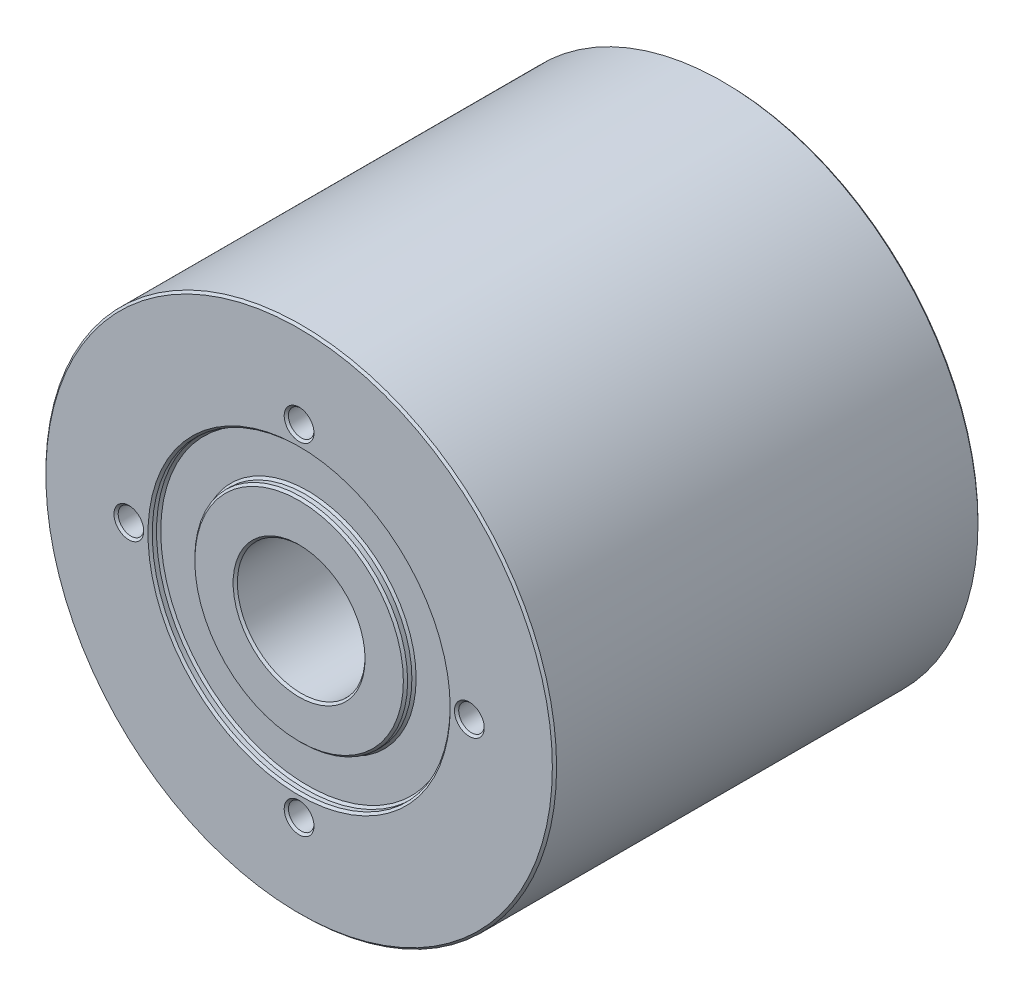
ISO-10303-21;
HEADER;
FILE_DESCRIPTION(('STEP AP214'),'2;1');
FILE_NAME('part.step','',(''),(''),'','','');
FILE_SCHEMA(('AUTOMOTIVE_DESIGN { 1 0 10303 214 1 1 1 1 }'));
ENDSEC;
DATA;
#1=APPLICATION_CONTEXT('core data for automotive mechanical design processes');
#2=APPLICATION_PROTOCOL_DEFINITION('international standard','automotive_design',2000,#1);
#3=PRODUCT_CONTEXT('',#1,'mechanical');
#4=PRODUCT('Part','Part','',(#3));
#5=PRODUCT_RELATED_PRODUCT_CATEGORY('part','',(#4));
#6=PRODUCT_DEFINITION_FORMATION('','',#4);
#7=PRODUCT_DEFINITION_CONTEXT('part definition',#1,'design');
#8=PRODUCT_DEFINITION('design','',#6,#7);
#9=PRODUCT_DEFINITION_SHAPE('','',#8);
#10=(LENGTH_UNIT() NAMED_UNIT(*) SI_UNIT(.MILLI.,.METRE.));
#11=(NAMED_UNIT(*) PLANE_ANGLE_UNIT() SI_UNIT($,.RADIAN.));
#12=(NAMED_UNIT(*) SI_UNIT($,.STERADIAN.) SOLID_ANGLE_UNIT());
#13=UNCERTAINTY_MEASURE_WITH_UNIT(LENGTH_MEASURE(1.E-05),#10,'distance_accuracy_value','');
#14=(GEOMETRIC_REPRESENTATION_CONTEXT(3) GLOBAL_UNCERTAINTY_ASSIGNED_CONTEXT((#13)) GLOBAL_UNIT_ASSIGNED_CONTEXT((#10,
#11,#12)) REPRESENTATION_CONTEXT('',''));
#15=CARTESIAN_POINT('',(0.,0.,0.));
#16=DIRECTION('',(0.,0.,1.));
#17=DIRECTION('',(1.,0.,0.));
#18=AXIS2_PLACEMENT_3D('',#15,#16,#17);
#19=CARTESIAN_POINT('',(1.664700123781E-13,0.,100.));
#20=DIRECTION('',(0.,0.,1.));
#21=DIRECTION('',(1.,0.,0.));
#22=AXIS2_PLACEMENT_3D('',#19,#20,#21);
#23=CYLINDRICAL_SURFACE('',#22,25.);
#24=DIRECTION('',(0.,0.,-1.));
#25=VECTOR('',#24,1.);
#26=CARTESIAN_POINT('',(25.,0.,100.));
#27=LINE('',#26,#25);
#28=CARTESIAN_POINT('',(25.,0.,99.5));
#29=VERTEX_POINT('',#28);
#30=CARTESIAN_POINT('',(25.,0.,98.5));
#31=VERTEX_POINT('',#30);
#32=EDGE_CURVE('E10',#29,#31,#27,.T.);
#33=ORIENTED_EDGE('',*,*,#32,.T.);
#34=CARTESIAN_POINT('',(1.664700123781E-13,0.,98.5));
#35=DIRECTION('',(0.,0.,1.));
#36=DIRECTION('',(1.,0.,0.));
#37=AXIS2_PLACEMENT_3D('',#34,#35,#36);
#38=CIRCLE('',#37,25.);
#39=EDGE_CURVE('E25',#31,#31,#38,.T.);
#40=ORIENTED_EDGE('',*,*,#39,.T.);
#41=ORIENTED_EDGE('',*,*,#32,.F.);
#42=CARTESIAN_POINT('',(1.664700123781E-13,0.,99.5));
#43=DIRECTION('',(0.,0.,1.));
#44=DIRECTION('',(1.,0.,0.));
#45=AXIS2_PLACEMENT_3D('',#42,#43,#44);
#46=CIRCLE('',#45,25.);
#47=EDGE_CURVE('E331',#29,#29,#46,.T.);
#48=ORIENTED_EDGE('',*,*,#47,.F.);
#49=EDGE_LOOP('',(#33,#40,#41,#48));
#50=FACE_BOUND('',#49,.T.);
#51=ADVANCED_FACE('F16',(#50),#23,.T.);
#52=CARTESIAN_POINT('',(1.664700123781E-13,0.,98.5));
#53=DIRECTION('',(0.,0.,-1.));
#54=DIRECTION('',(1.,0.,0.));
#55=AXIS2_PLACEMENT_3D('',#52,#53,#54);
#56=CONICAL_SURFACE('',#55,25.,0.785398163397);
#57=DIRECTION('',(-0.707106781186548,0.,0.707106781186548));
#58=VECTOR('',#57,1.);
#59=CARTESIAN_POINT('',(25.,0.,98.5));
#60=LINE('',#59,#58);
#61=CARTESIAN_POINT('',(25.5,0.,98.));
#62=VERTEX_POINT('',#61);
#63=EDGE_CURVE('E338',#62,#31,#60,.T.);
#64=ORIENTED_EDGE('',*,*,#63,.F.);
#65=CARTESIAN_POINT('',(1.664700123781E-13,0.,98.));
#66=DIRECTION('',(0.,0.,1.));
#67=DIRECTION('',(1.,0.,0.));
#68=AXIS2_PLACEMENT_3D('',#65,#66,#67);
#69=CIRCLE('',#68,25.5);
#70=EDGE_CURVE('E327',#62,#62,#69,.T.);
#71=ORIENTED_EDGE('',*,*,#70,.T.);
#72=ORIENTED_EDGE('',*,*,#63,.T.);
#73=ORIENTED_EDGE('',*,*,#39,.F.);
#74=EDGE_LOOP('',(#64,#71,#72,#73));
#75=FACE_BOUND('',#74,.T.);
#76=ADVANCED_FACE('F18',(#75),#56,.T.);
#77=CARTESIAN_POINT('',(1.664700123781E-13,0.,99.5));
#78=DIRECTION('',(0.,0.,-1.));
#79=DIRECTION('',(1.,0.,0.));
#80=AXIS2_PLACEMENT_3D('',#77,#78,#79);
#81=CONICAL_SURFACE('',#80,25.,0.785398163397);
#82=ORIENTED_EDGE('',*,*,#47,.T.);
#83=DIRECTION('',(0.707106781186548,0.,-0.707106781186548));
#84=VECTOR('',#83,1.);
#85=CARTESIAN_POINT('',(25.,0.,99.5));
#86=LINE('',#85,#84);
#87=CARTESIAN_POINT('',(24.5,0.,100.));
#88=VERTEX_POINT('',#87);
#89=EDGE_CURVE('E335',#88,#29,#86,.T.);
#90=ORIENTED_EDGE('',*,*,#89,.F.);
#91=CARTESIAN_POINT('',(1.664700123781E-13,0.,100.));
#92=DIRECTION('',(0.,0.,1.));
#93=DIRECTION('',(1.,0.,0.));
#94=AXIS2_PLACEMENT_3D('',#91,#92,#93);
#95=CIRCLE('',#94,24.5);
#96=EDGE_CURVE('E323',#88,#88,#95,.T.);
#97=ORIENTED_EDGE('',*,*,#96,.F.);
#98=ORIENTED_EDGE('',*,*,#89,.T.);
#99=EDGE_LOOP('',(#82,#90,#97,#98));
#100=FACE_BOUND('',#99,.T.);
#101=ADVANCED_FACE('F351',(#100),#81,.T.);
#102=CARTESIAN_POINT('',(0.,0.,98.));
#103=DIRECTION('',(0.,0.,1.));
#104=DIRECTION('',(1.,0.,0.));
#105=AXIS2_PLACEMENT_3D('',#102,#103,#104);
#106=PLANE('',#105);
#107=ORIENTED_EDGE('',*,*,#70,.F.);
#108=EDGE_LOOP('',(#107));
#109=FACE_BOUND('',#108,.T.);
#110=CARTESIAN_POINT('',(0.,0.,98.));
#111=DIRECTION('',(0.,0.,1.));
#112=DIRECTION('',(1.,0.,0.));
#113=AXIS2_PLACEMENT_3D('',#110,#111,#112);
#114=CIRCLE('',#113,34.5);
#115=CARTESIAN_POINT('',(34.5,0.,98.));
#116=VERTEX_POINT('',#115);
#117=EDGE_CURVE('E320',#116,#116,#114,.T.);
#118=ORIENTED_EDGE('',*,*,#117,.T.);
#119=EDGE_LOOP('',(#118));
#120=FACE_BOUND('',#119,.T.);
#121=ADVANCED_FACE('F347',(#109,#120),#106,.T.);
#122=CARTESIAN_POINT('',(0.,0.,100.));
#123=DIRECTION('',(0.,0.,1.));
#124=DIRECTION('',(1.,0.,0.));
#125=AXIS2_PLACEMENT_3D('',#122,#123,#124);
#126=PLANE('',#125);
#127=ORIENTED_EDGE('',*,*,#96,.T.);
#128=EDGE_LOOP('',(#127));
#129=FACE_BOUND('',#128,.T.);
#130=CARTESIAN_POINT('',(0.,0.,100.));
#131=DIRECTION('',(0.,0.,-1.));
#132=DIRECTION('',(1.,0.,0.));
#133=AXIS2_PLACEMENT_3D('',#130,#131,#132);
#134=CIRCLE('',#133,15.5);
#135=CARTESIAN_POINT('',(15.5,0.,100.));
#136=VERTEX_POINT('',#135);
#137=EDGE_CURVE('E285',#136,#136,#134,.T.);
#138=ORIENTED_EDGE('',*,*,#137,.T.);
#139=EDGE_LOOP('',(#138));
#140=FACE_BOUND('',#139,.T.);
#141=ADVANCED_FACE('F350',(#129,#140),#126,.T.);
#142=CARTESIAN_POINT('',(0.,0.,98.5));
#143=DIRECTION('',(0.,0.,1.));
#144=DIRECTION('',(1.,0.,0.));
#145=AXIS2_PLACEMENT_3D('',#142,#143,#144);
#146=CONICAL_SURFACE('',#145,35.,0.785398163397);
#147=DIRECTION('',(-0.707106781186548,0.,-0.707106781186548));
#148=VECTOR('',#147,1.);
#149=CARTESIAN_POINT('',(35.,0.,98.5));
#150=LINE('',#149,#148);
#151=CARTESIAN_POINT('',(35.,0.,98.5));
#152=VERTEX_POINT('',#151);
#153=EDGE_CURVE('E288',#152,#116,#150,.T.);
#154=ORIENTED_EDGE('',*,*,#153,.F.);
#155=CARTESIAN_POINT('',(0.,0.,98.5));
#156=DIRECTION('',(0.,0.,1.));
#157=DIRECTION('',(1.,0.,0.));
#158=AXIS2_PLACEMENT_3D('',#155,#156,#157);
#159=CIRCLE('',#158,35.);
#160=EDGE_CURVE('E310',#152,#152,#159,.T.);
#161=ORIENTED_EDGE('',*,*,#160,.T.);
#162=ORIENTED_EDGE('',*,*,#153,.T.);
#163=ORIENTED_EDGE('',*,*,#117,.F.);
#164=EDGE_LOOP('',(#154,#161,#162,#163));
#165=FACE_BOUND('',#164,.T.);
#166=ADVANCED_FACE('F355',(#165),#146,.F.);
#167=CARTESIAN_POINT('',(0.,0.,99.5));
#168=DIRECTION('',(0.,0.,1.));
#169=DIRECTION('',(1.,0.,0.));
#170=AXIS2_PLACEMENT_3D('',#167,#168,#169);
#171=CONICAL_SURFACE('',#170,15.,0.785398163397);
#172=DIRECTION('',(0.707106781186548,0.,0.707106781186548));
#173=VECTOR('',#172,1.);
#174=CARTESIAN_POINT('',(15.,0.,99.5));
#175=LINE('',#174,#173);
#176=CARTESIAN_POINT('',(15.,0.,99.5));
#177=VERTEX_POINT('',#176);
#178=EDGE_CURVE('E289',#177,#136,#175,.T.);
#179=ORIENTED_EDGE('',*,*,#178,.F.);
#180=CARTESIAN_POINT('',(0.,0.,99.5));
#181=DIRECTION('',(0.,0.,-1.));
#182=DIRECTION('',(1.,0.,0.));
#183=AXIS2_PLACEMENT_3D('',#180,#181,#182);
#184=CIRCLE('',#183,15.);
#185=EDGE_CURVE('E296',#177,#177,#184,.T.);
#186=ORIENTED_EDGE('',*,*,#185,.T.);
#187=ORIENTED_EDGE('',*,*,#178,.T.);
#188=ORIENTED_EDGE('',*,*,#137,.F.);
#189=EDGE_LOOP('',(#179,#186,#187,#188));
#190=FACE_BOUND('',#189,.T.);
#191=ADVANCED_FACE('F445',(#190),#171,.F.);
#192=CARTESIAN_POINT('',(0.,0.,100.));
#193=DIRECTION('',(0.,0.,1.));
#194=DIRECTION('',(1.,0.,0.));
#195=AXIS2_PLACEMENT_3D('',#192,#193,#194);
#196=CYLINDRICAL_SURFACE('',#195,35.);
#197=CARTESIAN_POINT('',(0.,0.,99.5));
#198=DIRECTION('',(0.,0.,1.));
#199=DIRECTION('',(1.,0.,0.));
#200=AXIS2_PLACEMENT_3D('',#197,#198,#199);
#201=CIRCLE('',#200,35.);
#202=CARTESIAN_POINT('',(35.,0.,99.5));
#203=VERTEX_POINT('',#202);
#204=EDGE_CURVE('E271',#203,#203,#201,.T.);
#205=ORIENTED_EDGE('',*,*,#204,.T.);
#206=DIRECTION('',(0.,0.,-1.));
#207=VECTOR('',#206,1.);
#208=CARTESIAN_POINT('',(35.,0.,100.));
#209=LINE('',#208,#207);
#210=EDGE_CURVE('E306',#203,#152,#209,.T.);
#211=ORIENTED_EDGE('',*,*,#210,.T.);
#212=ORIENTED_EDGE('',*,*,#160,.F.);
#213=ORIENTED_EDGE('',*,*,#210,.F.);
#214=EDGE_LOOP('',(#205,#211,#212,#213));
#215=FACE_BOUND('',#214,.T.);
#216=ADVANCED_FACE('F358',(#215),#196,.F.);
#217=CARTESIAN_POINT('',(0.,40.,0.));
#218=DIRECTION('',(0.,0.,-1.));
#219=DIRECTION('',(0.,1.,0.));
#220=AXIS2_PLACEMENT_3D('',#217,#218,#219);
#221=CYLINDRICAL_SURFACE('',#220,3.);
#222=DIRECTION('',(0.,0.,1.));
#223=VECTOR('',#222,1.);
#224=CARTESIAN_POINT('',(0.,43.,0.));
#225=LINE('',#224,#223);
#226=CARTESIAN_POINT('',(0.,43.,0.5));
#227=VERTEX_POINT('',#226);
#228=CARTESIAN_POINT('',(0.,43.,99.5));
#229=VERTEX_POINT('',#228);
#230=EDGE_CURVE('E303',#227,#229,#225,.T.);
#231=ORIENTED_EDGE('',*,*,#230,.F.);
#232=CARTESIAN_POINT('',(0.,40.,0.5));
#233=DIRECTION('',(0.,0.,1.));
#234=DIRECTION('',(0.,1.,0.));
#235=AXIS2_PLACEMENT_3D('',#232,#233,#234);
#236=CIRCLE('',#235,3.);
#237=EDGE_CURVE('E242',#227,#227,#236,.T.);
#238=ORIENTED_EDGE('',*,*,#237,.F.);
#239=ORIENTED_EDGE('',*,*,#230,.T.);
#240=CARTESIAN_POINT('',(0.,40.,99.5));
#241=DIRECTION('',(0.,0.,-1.));
#242=DIRECTION('',(0.,1.,0.));
#243=AXIS2_PLACEMENT_3D('',#240,#241,#242);
#244=CIRCLE('',#243,3.);
#245=EDGE_CURVE('E196',#229,#229,#244,.T.);
#246=ORIENTED_EDGE('',*,*,#245,.F.);
#247=EDGE_LOOP('',(#231,#238,#239,#246));
#248=FACE_BOUND('',#247,.T.);
#249=ADVANCED_FACE('F441',(#248),#221,.F.);
#250=CARTESIAN_POINT('',(-40.,0.,0.));
#251=DIRECTION('',(0.,0.,-1.));
#252=DIRECTION('',(-1.,0.,0.));
#253=AXIS2_PLACEMENT_3D('',#250,#251,#252);
#254=CYLINDRICAL_SURFACE('',#253,3.);
#255=DIRECTION('',(0.,0.,1.));
#256=VECTOR('',#255,1.);
#257=CARTESIAN_POINT('',(-43.,0.,0.));
#258=LINE('',#257,#256);
#259=CARTESIAN_POINT('',(-43.,0.,0.5));
#260=VERTEX_POINT('',#259);
#261=CARTESIAN_POINT('',(-43.,0.,99.5));
#262=VERTEX_POINT('',#261);
#263=EDGE_CURVE('E300',#260,#262,#258,.T.);
#264=ORIENTED_EDGE('',*,*,#263,.F.);
#265=CARTESIAN_POINT('',(-40.,0.,0.5));
#266=DIRECTION('',(0.,0.,1.));
#267=DIRECTION('',(-1.,0.,0.));
#268=AXIS2_PLACEMENT_3D('',#265,#266,#267);
#269=CIRCLE('',#268,3.);
#270=EDGE_CURVE('E171',#260,#260,#269,.T.);
#271=ORIENTED_EDGE('',*,*,#270,.F.);
#272=ORIENTED_EDGE('',*,*,#263,.T.);
#273=CARTESIAN_POINT('',(-40.,0.,99.5));
#274=DIRECTION('',(0.,0.,-1.));
#275=DIRECTION('',(-1.,0.,0.));
#276=AXIS2_PLACEMENT_3D('',#273,#274,#275);
#277=CIRCLE('',#276,3.);
#278=EDGE_CURVE('E259',#262,#262,#277,.T.);
#279=ORIENTED_EDGE('',*,*,#278,.F.);
#280=EDGE_LOOP('',(#264,#271,#272,#279));
#281=FACE_BOUND('',#280,.T.);
#282=ADVANCED_FACE('F439',(#281),#254,.F.);
#283=CARTESIAN_POINT('',(0.,0.,0.));
#284=DIRECTION('',(0.,0.,-1.));
#285=DIRECTION('',(1.,0.,0.));
#286=AXIS2_PLACEMENT_3D('',#283,#284,#285);
#287=CYLINDRICAL_SURFACE('',#286,15.);
#288=DIRECTION('',(0.,0.,1.));
#289=VECTOR('',#288,1.);
#290=CARTESIAN_POINT('',(15.,0.,0.));
#291=LINE('',#290,#289);
#292=CARTESIAN_POINT('',(15.,0.,0.5));
#293=VERTEX_POINT('',#292);
#294=EDGE_CURVE('E292',#293,#177,#291,.T.);
#295=ORIENTED_EDGE('',*,*,#294,.F.);
#296=CARTESIAN_POINT('',(0.,0.,0.5));
#297=DIRECTION('',(0.,0.,1.));
#298=DIRECTION('',(1.,0.,0.));
#299=AXIS2_PLACEMENT_3D('',#296,#297,#298);
#300=CIRCLE('',#299,15.);
#301=EDGE_CURVE('E169',#293,#293,#300,.T.);
#302=ORIENTED_EDGE('',*,*,#301,.F.);
#303=ORIENTED_EDGE('',*,*,#294,.T.);
#304=ORIENTED_EDGE('',*,*,#185,.F.);
#305=EDGE_LOOP('',(#295,#302,#303,#304));
#306=FACE_BOUND('',#305,.T.);
#307=ADVANCED_FACE('F462',(#306),#287,.F.);
#308=CARTESIAN_POINT('',(40.,0.,0.));
#309=DIRECTION('',(0.,0.,-1.));
#310=DIRECTION('',(1.,0.,0.));
#311=AXIS2_PLACEMENT_3D('',#308,#309,#310);
#312=CYLINDRICAL_SURFACE('',#311,3.);
#313=DIRECTION('',(0.,0.,1.));
#314=VECTOR('',#313,1.);
#315=CARTESIAN_POINT('',(43.,0.,0.));
#316=LINE('',#315,#314);
#317=CARTESIAN_POINT('',(43.,0.,0.5));
#318=VERTEX_POINT('',#317);
#319=CARTESIAN_POINT('',(43.,0.,99.5));
#320=VERTEX_POINT('',#319);
#321=EDGE_CURVE('E284',#318,#320,#316,.T.);
#322=ORIENTED_EDGE('',*,*,#321,.F.);
#323=CARTESIAN_POINT('',(40.,0.,0.5));
#324=DIRECTION('',(0.,0.,1.));
#325=DIRECTION('',(1.,0.,0.));
#326=AXIS2_PLACEMENT_3D('',#323,#324,#325);
#327=CIRCLE('',#326,3.);
#328=EDGE_CURVE('E225',#318,#318,#327,.T.);
#329=ORIENTED_EDGE('',*,*,#328,.F.);
#330=ORIENTED_EDGE('',*,*,#321,.T.);
#331=CARTESIAN_POINT('',(40.,0.,99.5));
#332=DIRECTION('',(0.,0.,-1.));
#333=DIRECTION('',(1.,0.,0.));
#334=AXIS2_PLACEMENT_3D('',#331,#332,#333);
#335=CIRCLE('',#334,3.);
#336=EDGE_CURVE('E275',#320,#320,#335,.T.);
#337=ORIENTED_EDGE('',*,*,#336,.F.);
#338=EDGE_LOOP('',(#322,#329,#330,#337));
#339=FACE_BOUND('',#338,.T.);
#340=ADVANCED_FACE('F464',(#339),#312,.F.);
#341=CARTESIAN_POINT('',(0.,-40.,0.));
#342=DIRECTION('',(0.,0.,-1.));
#343=DIRECTION('',(0.,-1.,0.));
#344=AXIS2_PLACEMENT_3D('',#341,#342,#343);
#345=CYLINDRICAL_SURFACE('',#344,3.);
#346=DIRECTION('',(0.,0.,1.));
#347=VECTOR('',#346,1.);
#348=CARTESIAN_POINT('',(0.,-43.,0.));
#349=LINE('',#348,#347);
#350=CARTESIAN_POINT('',(0.,-43.,0.5));
#351=VERTEX_POINT('',#350);
#352=CARTESIAN_POINT('',(0.,-43.,99.5));
#353=VERTEX_POINT('',#352);
#354=EDGE_CURVE('E195',#351,#353,#349,.T.);
#355=ORIENTED_EDGE('',*,*,#354,.F.);
#356=CARTESIAN_POINT('',(0.,-40.,0.5));
#357=DIRECTION('',(0.,0.,1.));
#358=DIRECTION('',(0.,-1.,0.));
#359=AXIS2_PLACEMENT_3D('',#356,#357,#358);
#360=CIRCLE('',#359,3.);
#361=EDGE_CURVE('E217',#351,#351,#360,.T.);
#362=ORIENTED_EDGE('',*,*,#361,.F.);
#363=ORIENTED_EDGE('',*,*,#354,.T.);
#364=CARTESIAN_POINT('',(0.,-40.,99.5));
#365=DIRECTION('',(0.,0.,-1.));
#366=DIRECTION('',(0.,-1.,0.));
#367=AXIS2_PLACEMENT_3D('',#364,#365,#366);
#368=CIRCLE('',#367,3.);
#369=EDGE_CURVE('E251',#353,#353,#368,.T.);
#370=ORIENTED_EDGE('',*,*,#369,.F.);
#371=EDGE_LOOP('',(#355,#362,#363,#370));
#372=FACE_BOUND('',#371,.T.);
#373=ADVANCED_FACE('F469',(#372),#345,.F.);
#374=CARTESIAN_POINT('',(0.,40.,99.5));
#375=DIRECTION('',(0.,0.,1.));
#376=DIRECTION('',(0.,1.,0.));
#377=AXIS2_PLACEMENT_3D('',#374,#375,#376);
#378=CONICAL_SURFACE('',#377,3.,0.785398163397);
#379=ORIENTED_EDGE('',*,*,#245,.T.);
#380=DIRECTION('',(0.,-0.707106781186548,-0.707106781186548));
#381=VECTOR('',#380,1.);
#382=CARTESIAN_POINT('',(0.,43.,99.5));
#383=LINE('',#382,#381);
#384=CARTESIAN_POINT('',(0.,43.5,100.));
#385=VERTEX_POINT('',#384);
#386=EDGE_CURVE('E191',#385,#229,#383,.T.);
#387=ORIENTED_EDGE('',*,*,#386,.F.);
#388=CARTESIAN_POINT('',(0.,40.,100.));
#389=DIRECTION('',(0.,0.,-1.));
#390=DIRECTION('',(0.,1.,0.));
#391=AXIS2_PLACEMENT_3D('',#388,#389,#390);
#392=CIRCLE('',#391,3.5);
#393=EDGE_CURVE('E213',#385,#385,#392,.T.);
#394=ORIENTED_EDGE('',*,*,#393,.F.);
#395=ORIENTED_EDGE('',*,*,#386,.T.);
#396=EDGE_LOOP('',(#379,#387,#394,#395));
#397=FACE_BOUND('',#396,.T.);
#398=ADVANCED_FACE('F476',(#397),#378,.F.);
#399=CARTESIAN_POINT('',(40.,0.,99.5));
#400=DIRECTION('',(0.,0.,1.));
#401=DIRECTION('',(1.,0.,0.));
#402=AXIS2_PLACEMENT_3D('',#399,#400,#401);
#403=CONICAL_SURFACE('',#402,3.,0.785398163397);
#404=ORIENTED_EDGE('',*,*,#336,.T.);
#405=DIRECTION('',(-0.707106781186548,0.,-0.707106781186548));
#406=VECTOR('',#405,1.);
#407=CARTESIAN_POINT('',(43.,0.,99.5));
#408=LINE('',#407,#406);
#409=CARTESIAN_POINT('',(43.5,0.,100.));
#410=VERTEX_POINT('',#409);
#411=EDGE_CURVE('E229',#410,#320,#408,.T.);
#412=ORIENTED_EDGE('',*,*,#411,.F.);
#413=CARTESIAN_POINT('',(40.,0.,100.));
#414=DIRECTION('',(0.,0.,-1.));
#415=DIRECTION('',(1.,0.,0.));
#416=AXIS2_PLACEMENT_3D('',#413,#414,#415);
#417=CIRCLE('',#416,3.5);
#418=EDGE_CURVE('E205',#410,#410,#417,.T.);
#419=ORIENTED_EDGE('',*,*,#418,.F.);
#420=ORIENTED_EDGE('',*,*,#411,.T.);
#421=EDGE_LOOP('',(#404,#412,#419,#420));
#422=FACE_BOUND('',#421,.T.);
#423=ADVANCED_FACE('F481',(#422),#403,.F.);
#424=CARTESIAN_POINT('',(0.,0.,99.5));
#425=DIRECTION('',(0.,0.,1.));
#426=DIRECTION('',(1.,0.,0.));
#427=AXIS2_PLACEMENT_3D('',#424,#425,#426);
#428=CONICAL_SURFACE('',#427,35.,0.785398163397);
#429=DIRECTION('',(-0.707106781186548,0.,-0.707106781186548));
#430=VECTOR('',#429,1.);
#431=CARTESIAN_POINT('',(35.,0.,99.5));
#432=LINE('',#431,#430);
#433=CARTESIAN_POINT('',(35.5,0.,100.));
#434=VERTEX_POINT('',#433);
#435=EDGE_CURVE('E267',#434,#203,#432,.T.);
#436=ORIENTED_EDGE('',*,*,#435,.F.);
#437=CARTESIAN_POINT('',(0.,0.,100.));
#438=DIRECTION('',(0.,0.,1.));
#439=DIRECTION('',(1.,0.,0.));
#440=AXIS2_PLACEMENT_3D('',#437,#438,#439);
#441=CIRCLE('',#440,35.5);
#442=EDGE_CURVE('E201',#434,#434,#441,.T.);
#443=ORIENTED_EDGE('',*,*,#442,.T.);
#444=ORIENTED_EDGE('',*,*,#435,.T.);
#445=ORIENTED_EDGE('',*,*,#204,.F.);
#446=EDGE_LOOP('',(#436,#443,#444,#445));
#447=FACE_BOUND('',#446,.T.);
#448=ADVANCED_FACE('F361',(#447),#428,.F.);
#449=CARTESIAN_POINT('',(-40.,0.,99.5));
#450=DIRECTION('',(0.,0.,1.));
#451=DIRECTION('',(-1.,0.,0.));
#452=AXIS2_PLACEMENT_3D('',#449,#450,#451);
#453=CONICAL_SURFACE('',#452,3.,0.785398163397);
#454=ORIENTED_EDGE('',*,*,#278,.T.);
#455=DIRECTION('',(0.707106781186548,0.,-0.707106781186548));
#456=VECTOR('',#455,1.);
#457=CARTESIAN_POINT('',(-43.,0.,99.5));
#458=LINE('',#457,#456);
#459=CARTESIAN_POINT('',(-43.5,0.,100.));
#460=VERTEX_POINT('',#459);
#461=EDGE_CURVE('E263',#460,#262,#458,.T.);
#462=ORIENTED_EDGE('',*,*,#461,.F.);
#463=CARTESIAN_POINT('',(-40.,0.,100.));
#464=DIRECTION('',(0.,0.,-1.));
#465=DIRECTION('',(-1.,0.,0.));
#466=AXIS2_PLACEMENT_3D('',#463,#464,#465);
#467=CIRCLE('',#466,3.5);
#468=EDGE_CURVE('E206',#460,#460,#467,.T.);
#469=ORIENTED_EDGE('',*,*,#468,.F.);
#470=ORIENTED_EDGE('',*,*,#461,.T.);
#471=EDGE_LOOP('',(#454,#462,#469,#470));
#472=FACE_BOUND('',#471,.T.);
#473=ADVANCED_FACE('F480',(#472),#453,.F.);
#474=CARTESIAN_POINT('',(0.,-40.,99.5));
#475=DIRECTION('',(0.,0.,1.));
#476=DIRECTION('',(0.,-1.,0.));
#477=AXIS2_PLACEMENT_3D('',#474,#475,#476);
#478=CONICAL_SURFACE('',#477,3.,0.785398163397);
#479=ORIENTED_EDGE('',*,*,#369,.T.);
#480=DIRECTION('',(0.,0.707106781186548,-0.707106781186548));
#481=VECTOR('',#480,1.);
#482=CARTESIAN_POINT('',(0.,-43.,99.5));
#483=LINE('',#482,#481);
#484=CARTESIAN_POINT('',(0.,-43.5,100.));
#485=VERTEX_POINT('',#484);
#486=EDGE_CURVE('E255',#485,#353,#483,.T.);
#487=ORIENTED_EDGE('',*,*,#486,.F.);
#488=CARTESIAN_POINT('',(0.,-40.,100.));
#489=DIRECTION('',(0.,0.,-1.));
#490=DIRECTION('',(0.,-1.,0.));
#491=AXIS2_PLACEMENT_3D('',#488,#489,#490);
#492=CIRCLE('',#491,3.5);
#493=EDGE_CURVE('E200',#485,#485,#492,.T.);
#494=ORIENTED_EDGE('',*,*,#493,.F.);
#495=ORIENTED_EDGE('',*,*,#486,.T.);
#496=EDGE_LOOP('',(#479,#487,#494,#495));
#497=FACE_BOUND('',#496,.T.);
#498=ADVANCED_FACE('F484',(#497),#478,.F.);
#499=CARTESIAN_POINT('',(0.,40.,0.5));
#500=DIRECTION('',(0.,0.,-1.));
#501=DIRECTION('',(0.,1.,0.));
#502=AXIS2_PLACEMENT_3D('',#499,#500,#501);
#503=CONICAL_SURFACE('',#502,3.,0.785398163397);
#504=ORIENTED_EDGE('',*,*,#237,.T.);
#505=DIRECTION('',(0.,-0.707106781186548,0.707106781186548));
#506=VECTOR('',#505,1.);
#507=CARTESIAN_POINT('',(0.,43.,0.5));
#508=LINE('',#507,#506);
#509=CARTESIAN_POINT('',(0.,43.5,0.));
#510=VERTEX_POINT('',#509);
#511=EDGE_CURVE('E247',#510,#227,#508,.T.);
#512=ORIENTED_EDGE('',*,*,#511,.F.);
#513=CARTESIAN_POINT('',(0.,40.,0.));
#514=DIRECTION('',(0.,0.,1.));
#515=DIRECTION('',(0.,1.,0.));
#516=AXIS2_PLACEMENT_3D('',#513,#514,#515);
#517=CIRCLE('',#516,3.5);
#518=EDGE_CURVE('E184',#510,#510,#517,.T.);
#519=ORIENTED_EDGE('',*,*,#518,.F.);
#520=ORIENTED_EDGE('',*,*,#511,.T.);
#521=EDGE_LOOP('',(#504,#512,#519,#520));
#522=FACE_BOUND('',#521,.T.);
#523=ADVANCED_FACE('F486',(#522),#503,.F.);
#524=CARTESIAN_POINT('',(-40.,0.,0.5));
#525=DIRECTION('',(0.,0.,-1.));
#526=DIRECTION('',(-1.,0.,0.));
#527=AXIS2_PLACEMENT_3D('',#524,#525,#526);
#528=CONICAL_SURFACE('',#527,3.,0.785398163397);
#529=ORIENTED_EDGE('',*,*,#270,.T.);
#530=DIRECTION('',(0.707106781186548,0.,0.707106781186548));
#531=VECTOR('',#530,1.);
#532=CARTESIAN_POINT('',(-43.,0.,0.5));
#533=LINE('',#532,#531);
#534=CARTESIAN_POINT('',(-43.5,0.,0.));
#535=VERTEX_POINT('',#534);
#536=EDGE_CURVE('E239',#535,#260,#533,.T.);
#537=ORIENTED_EDGE('',*,*,#536,.F.);
#538=CARTESIAN_POINT('',(-40.,0.,0.));
#539=DIRECTION('',(0.,0.,1.));
#540=DIRECTION('',(-1.,0.,0.));
#541=AXIS2_PLACEMENT_3D('',#538,#539,#540);
#542=CIRCLE('',#541,3.5);
#543=EDGE_CURVE('E177',#535,#535,#542,.T.);
#544=ORIENTED_EDGE('',*,*,#543,.F.);
#545=ORIENTED_EDGE('',*,*,#536,.T.);
#546=EDGE_LOOP('',(#529,#537,#544,#545));
#547=FACE_BOUND('',#546,.T.);
#548=ADVANCED_FACE('F489',(#547),#528,.F.);
#549=CARTESIAN_POINT('',(0.,0.,0.5));
#550=DIRECTION('',(0.,0.,-1.));
#551=DIRECTION('',(1.,0.,0.));
#552=AXIS2_PLACEMENT_3D('',#549,#550,#551);
#553=CONICAL_SURFACE('',#552,15.,0.785398163397);
#554=ORIENTED_EDGE('',*,*,#301,.T.);
#555=DIRECTION('',(-0.707106781186548,0.,0.707106781186548));
#556=VECTOR('',#555,1.);
#557=CARTESIAN_POINT('',(15.,0.,0.5));
#558=LINE('',#557,#556);
#559=CARTESIAN_POINT('',(15.5,0.,0.));
#560=VERTEX_POINT('',#559);
#561=EDGE_CURVE('E164',#560,#293,#558,.T.);
#562=ORIENTED_EDGE('',*,*,#561,.F.);
#563=CARTESIAN_POINT('',(0.,0.,0.));
#564=DIRECTION('',(0.,0.,1.));
#565=DIRECTION('',(1.,0.,0.));
#566=AXIS2_PLACEMENT_3D('',#563,#564,#565);
#567=CIRCLE('',#566,15.5);
#568=EDGE_CURVE('E167',#560,#560,#567,.T.);
#569=ORIENTED_EDGE('',*,*,#568,.F.);
#570=ORIENTED_EDGE('',*,*,#561,.T.);
#571=EDGE_LOOP('',(#554,#562,#569,#570));
#572=FACE_BOUND('',#571,.T.);
#573=ADVANCED_FACE('F166',(#572),#553,.F.);
#574=CARTESIAN_POINT('',(40.,0.,0.5));
#575=DIRECTION('',(0.,0.,-1.));
#576=DIRECTION('',(1.,0.,0.));
#577=AXIS2_PLACEMENT_3D('',#574,#575,#576);
#578=CONICAL_SURFACE('',#577,3.,0.785398163397);
#579=ORIENTED_EDGE('',*,*,#328,.T.);
#580=DIRECTION('',(-0.707106781186548,0.,0.707106781186548));
#581=VECTOR('',#580,1.);
#582=CARTESIAN_POINT('',(43.,0.,0.5));
#583=LINE('',#582,#581);
#584=CARTESIAN_POINT('',(43.5,0.,0.));
#585=VERTEX_POINT('',#584);
#586=EDGE_CURVE('E233',#585,#318,#583,.T.);
#587=ORIENTED_EDGE('',*,*,#586,.F.);
#588=CARTESIAN_POINT('',(40.,0.,0.));
#589=DIRECTION('',(0.,0.,1.));
#590=DIRECTION('',(1.,0.,0.));
#591=AXIS2_PLACEMENT_3D('',#588,#589,#590);
#592=CIRCLE('',#591,3.5);
#593=EDGE_CURVE('E178',#585,#585,#592,.T.);
#594=ORIENTED_EDGE('',*,*,#593,.F.);
#595=ORIENTED_EDGE('',*,*,#586,.T.);
#596=EDGE_LOOP('',(#579,#587,#594,#595));
#597=FACE_BOUND('',#596,.T.);
#598=ADVANCED_FACE('F496',(#597),#578,.F.);
#599=CARTESIAN_POINT('',(0.,-40.,0.5));
#600=DIRECTION('',(0.,0.,-1.));
#601=DIRECTION('',(0.,-1.,0.));
#602=AXIS2_PLACEMENT_3D('',#599,#600,#601);
#603=CONICAL_SURFACE('',#602,3.,0.785398163397);
#604=ORIENTED_EDGE('',*,*,#361,.T.);
#605=DIRECTION('',(0.,0.707106781186548,0.707106781186548));
#606=VECTOR('',#605,1.);
#607=CARTESIAN_POINT('',(0.,-43.,0.5));
#608=LINE('',#607,#606);
#609=CARTESIAN_POINT('',(0.,-43.5,0.));
#610=VERTEX_POINT('',#609);
#611=EDGE_CURVE('E221',#610,#351,#608,.T.);
#612=ORIENTED_EDGE('',*,*,#611,.F.);
#613=CARTESIAN_POINT('',(0.,-40.,0.));
#614=DIRECTION('',(0.,0.,1.));
#615=DIRECTION('',(0.,-1.,0.));
#616=AXIS2_PLACEMENT_3D('',#613,#614,#615);
#617=CIRCLE('',#616,3.5);
#618=EDGE_CURVE('E187',#610,#610,#617,.T.);
#619=ORIENTED_EDGE('',*,*,#618,.F.);
#620=ORIENTED_EDGE('',*,*,#611,.T.);
#621=EDGE_LOOP('',(#604,#612,#619,#620));
#622=FACE_BOUND('',#621,.T.);
#623=ADVANCED_FACE('F367',(#622),#603,.F.);
#624=CARTESIAN_POINT('',(0.,0.,100.));
#625=DIRECTION('',(0.,0.,1.));
#626=DIRECTION('',(1.,0.,0.));
#627=AXIS2_PLACEMENT_3D('',#624,#625,#626);
#628=PLANE('',#627);
#629=ORIENTED_EDGE('',*,*,#393,.T.);
#630=EDGE_LOOP('',(#629));
#631=FACE_BOUND('',#630,.T.);
#632=ORIENTED_EDGE('',*,*,#418,.T.);
#633=EDGE_LOOP('',(#632));
#634=FACE_BOUND('',#633,.T.);
#635=ORIENTED_EDGE('',*,*,#442,.F.);
#636=EDGE_LOOP('',(#635));
#637=FACE_BOUND('',#636,.T.);
#638=ORIENTED_EDGE('',*,*,#468,.T.);
#639=EDGE_LOOP('',(#638));
#640=FACE_BOUND('',#639,.T.);
#641=ORIENTED_EDGE('',*,*,#493,.T.);
#642=EDGE_LOOP('',(#641));
#643=FACE_BOUND('',#642,.T.);
#644=CARTESIAN_POINT('',(0.,0.,100.));
#645=DIRECTION('',(0.,0.,1.));
#646=DIRECTION('',(1.,0.,0.));
#647=AXIS2_PLACEMENT_3D('',#644,#645,#646);
#648=CIRCLE('',#647,59.5);
#649=CARTESIAN_POINT('',(59.5,0.,100.));
#650=VERTEX_POINT('',#649);
#651=EDGE_CURVE('E375',#650,#650,#648,.T.);
#652=ORIENTED_EDGE('',*,*,#651,.T.);
#653=EDGE_LOOP('',(#652));
#654=FACE_BOUND('',#653,.T.);
#655=ADVANCED_FACE('F364',(#631,#634,#637,#640,#643,#654),#628,.T.);
#656=CARTESIAN_POINT('',(0.,0.,0.));
#657=DIRECTION('',(0.,0.,1.));
#658=DIRECTION('',(1.,0.,0.));
#659=AXIS2_PLACEMENT_3D('',#656,#657,#658);
#660=PLANE('',#659);
#661=ORIENTED_EDGE('',*,*,#518,.T.);
#662=EDGE_LOOP('',(#661));
#663=FACE_BOUND('',#662,.T.);
#664=ORIENTED_EDGE('',*,*,#543,.T.);
#665=EDGE_LOOP('',(#664));
#666=FACE_BOUND('',#665,.T.);
#667=ORIENTED_EDGE('',*,*,#568,.T.);
#668=EDGE_LOOP('',(#667));
#669=FACE_BOUND('',#668,.T.);
#670=ORIENTED_EDGE('',*,*,#593,.T.);
#671=EDGE_LOOP('',(#670));
#672=FACE_BOUND('',#671,.T.);
#673=ORIENTED_EDGE('',*,*,#618,.T.);
#674=EDGE_LOOP('',(#673));
#675=FACE_BOUND('',#674,.T.);
#676=CARTESIAN_POINT('',(0.,0.,0.));
#677=DIRECTION('',(0.,0.,1.));
#678=DIRECTION('',(1.,0.,0.));
#679=AXIS2_PLACEMENT_3D('',#676,#677,#678);
#680=CIRCLE('',#679,59.5);
#681=CARTESIAN_POINT('',(59.5,0.,0.));
#682=VERTEX_POINT('',#681);
#683=EDGE_CURVE('E393',#682,#682,#680,.T.);
#684=ORIENTED_EDGE('',*,*,#683,.F.);
#685=EDGE_LOOP('',(#684));
#686=FACE_BOUND('',#685,.T.);
#687=ADVANCED_FACE('F174',(#663,#666,#669,#672,#675,#686),#660,.F.);
#688=CARTESIAN_POINT('',(0.,0.,99.5));
#689=DIRECTION('',(0.,0.,-1.));
#690=DIRECTION('',(1.,0.,0.));
#691=AXIS2_PLACEMENT_3D('',#688,#689,#690);
#692=CONICAL_SURFACE('',#691,60.,0.785398163397);
#693=DIRECTION('',(-0.707106781186548,0.,0.707106781186548));
#694=VECTOR('',#693,1.);
#695=CARTESIAN_POINT('',(60.,0.,99.5));
#696=LINE('',#695,#694);
#697=CARTESIAN_POINT('',(60.,0.,99.5));
#698=VERTEX_POINT('',#697);
#699=EDGE_CURVE('E379',#698,#650,#696,.T.);
#700=ORIENTED_EDGE('',*,*,#699,.F.);
#701=CARTESIAN_POINT('',(0.,0.,99.5));
#702=DIRECTION('',(0.,0.,1.));
#703=DIRECTION('',(1.,0.,0.));
#704=AXIS2_PLACEMENT_3D('',#701,#702,#703);
#705=CIRCLE('',#704,60.);
#706=EDGE_CURVE('E400',#698,#698,#705,.T.);
#707=ORIENTED_EDGE('',*,*,#706,.T.);
#708=ORIENTED_EDGE('',*,*,#699,.T.);
#709=ORIENTED_EDGE('',*,*,#651,.F.);
#710=EDGE_LOOP('',(#700,#707,#708,#709));
#711=FACE_BOUND('',#710,.T.);
#712=ADVANCED_FACE('F422',(#711),#692,.T.);
#713=CARTESIAN_POINT('',(0.,0.,0.5));
#714=DIRECTION('',(0.,0.,1.));
#715=DIRECTION('',(1.,0.,0.));
#716=AXIS2_PLACEMENT_3D('',#713,#714,#715);
#717=CONICAL_SURFACE('',#716,60.,0.785398163397);
#718=ORIENTED_EDGE('',*,*,#683,.T.);
#719=DIRECTION('',(-0.707106781186548,0.,-0.707106781186548));
#720=VECTOR('',#719,1.);
#721=CARTESIAN_POINT('',(60.,0.,0.5));
#722=LINE('',#721,#720);
#723=CARTESIAN_POINT('',(60.,0.,0.5));
#724=VERTEX_POINT('',#723);
#725=EDGE_CURVE('E385',#724,#682,#722,.T.);
#726=ORIENTED_EDGE('',*,*,#725,.F.);
#727=CARTESIAN_POINT('',(0.,0.,0.5));
#728=DIRECTION('',(0.,0.,1.));
#729=DIRECTION('',(1.,0.,0.));
#730=AXIS2_PLACEMENT_3D('',#727,#728,#729);
#731=CIRCLE('',#730,60.);
#732=EDGE_CURVE('E404',#724,#724,#731,.T.);
#733=ORIENTED_EDGE('',*,*,#732,.F.);
#734=ORIENTED_EDGE('',*,*,#725,.T.);
#735=EDGE_LOOP('',(#718,#726,#733,#734));
#736=FACE_BOUND('',#735,.T.);
#737=ADVANCED_FACE('F418',(#736),#717,.T.);
#738=CARTESIAN_POINT('',(0.,0.,0.));
#739=DIRECTION('',(0.,0.,1.));
#740=DIRECTION('',(1.,0.,0.));
#741=AXIS2_PLACEMENT_3D('',#738,#739,#740);
#742=CYLINDRICAL_SURFACE('',#741,60.);
#743=DIRECTION('',(0.,0.,1.));
#744=VECTOR('',#743,1.);
#745=CARTESIAN_POINT('',(60.,0.,0.));
#746=LINE('',#745,#744);
#747=EDGE_CURVE('E408',#724,#698,#746,.T.);
#748=ORIENTED_EDGE('',*,*,#747,.F.);
#749=ORIENTED_EDGE('',*,*,#732,.T.);
#750=ORIENTED_EDGE('',*,*,#747,.T.);
#751=ORIENTED_EDGE('',*,*,#706,.F.);
#752=EDGE_LOOP('',(#748,#749,#750,#751));
#753=FACE_BOUND('',#752,.T.);
#754=ADVANCED_FACE('F415',(#753),#742,.T.);
#755=CLOSED_SHELL('',(#51,#76,#101,#121,#141,#166,#191,#216,#249,#282,#307,#340,#373,#398,#423,
#448,#473,#498,#523,#548,#573,#598,#623,#655,#687,#712,#737,#754));
#756=MANIFOLD_SOLID_BREP('B1',#755);
#757=ADVANCED_BREP_SHAPE_REPRESENTATION('',(#18,#756),#14);
#758=SHAPE_DEFINITION_REPRESENTATION(#9,#757);
ENDSEC;
END-ISO-10303-21;
